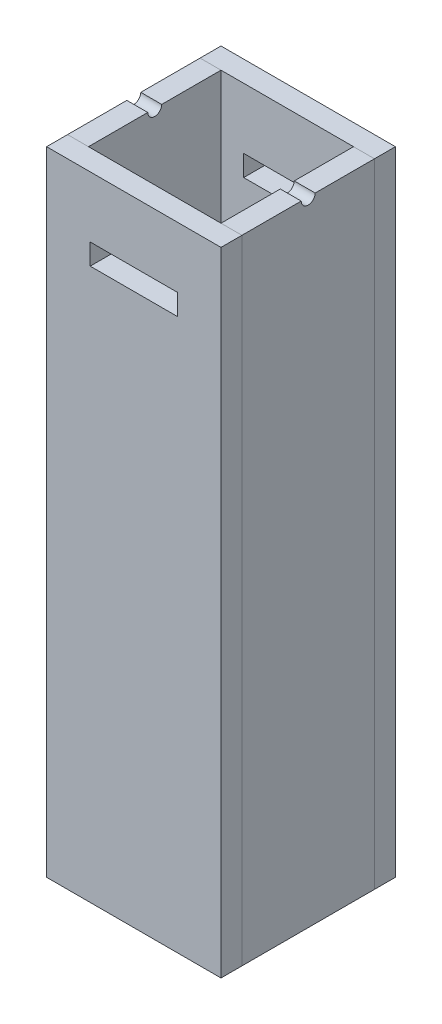
ISO-10303-21;
HEADER;
FILE_DESCRIPTION(('STEP AP214'),'2;1');
FILE_NAME('part.step','',(''),(''),'','','');
FILE_SCHEMA(('AUTOMOTIVE_DESIGN { 1 0 10303 214 1 1 1 1 }'));
ENDSEC;
DATA;
#1=APPLICATION_CONTEXT('core data for automotive mechanical design processes');
#2=APPLICATION_PROTOCOL_DEFINITION('international standard','automotive_design',2000,#1);
#3=PRODUCT_CONTEXT('',#1,'mechanical');
#4=PRODUCT('Part','Part','',(#3));
#5=PRODUCT_RELATED_PRODUCT_CATEGORY('part','',(#4));
#6=PRODUCT_DEFINITION_FORMATION('','',#4);
#7=PRODUCT_DEFINITION_CONTEXT('part definition',#1,'design');
#8=PRODUCT_DEFINITION('design','',#6,#7);
#9=PRODUCT_DEFINITION_SHAPE('','',#8);
#10=(LENGTH_UNIT() NAMED_UNIT(*) SI_UNIT(.MILLI.,.METRE.));
#11=(NAMED_UNIT(*) PLANE_ANGLE_UNIT() SI_UNIT($,.RADIAN.));
#12=(NAMED_UNIT(*) SI_UNIT($,.STERADIAN.) SOLID_ANGLE_UNIT());
#13=UNCERTAINTY_MEASURE_WITH_UNIT(LENGTH_MEASURE(1.E-05),#10,'distance_accuracy_value','');
#14=(GEOMETRIC_REPRESENTATION_CONTEXT(3) GLOBAL_UNCERTAINTY_ASSIGNED_CONTEXT((#13)) GLOBAL_UNIT_ASSIGNED_CONTEXT((#10,
#11,#12)) REPRESENTATION_CONTEXT('',''));
#15=CARTESIAN_POINT('',(0.,0.,0.));
#16=DIRECTION('',(0.,0.,1.));
#17=DIRECTION('',(1.,0.,0.));
#18=AXIS2_PLACEMENT_3D('',#15,#16,#17);
#19=CARTESIAN_POINT('',(-27.4556983702636,181.4148,200.513993011668));
#20=DIRECTION('',(0.,-1.,0.));
#21=DIRECTION('',(0.,0.,-1.));
#22=AXIS2_PLACEMENT_3D('',#19,#20,#21);
#23=PLANE('',#22);
#24=DIRECTION('',(0.,0.,-1.));
#25=VECTOR('',#24,1.);
#26=CARTESIAN_POINT('',(-27.4556983702636,181.4148,200.513993011668));
#27=LINE('',#26,#25);
#28=CARTESIAN_POINT('',(-27.4556983702636,181.4148,-2.));
#29=VERTEX_POINT('',#28);
#30=CARTESIAN_POINT('',(-27.4556983702636,181.4148,-19.));
#31=VERTEX_POINT('',#30);
#32=EDGE_CURVE('E107',#29,#31,#27,.T.);
#33=ORIENTED_EDGE('',*,*,#32,.F.);
#34=DIRECTION('',(1.,0.,0.));
#35=VECTOR('',#34,1.);
#36=CARTESIAN_POINT('',(-33.112552619756,181.4148,-2.));
#37=LINE('',#36,#35);
#38=CARTESIAN_POINT('',(-21.4556983702636,181.4148,-2.));
#39=VERTEX_POINT('',#38);
#40=EDGE_CURVE('E12',#29,#39,#37,.T.);
#41=ORIENTED_EDGE('',*,*,#40,.T.);
#42=DIRECTION('',(0.,0.,-1.));
#43=VECTOR('',#42,1.);
#44=CARTESIAN_POINT('',(-21.4556983702636,181.4148,200.513993011668));
#45=LINE('',#44,#43);
#46=CARTESIAN_POINT('',(-21.4556983702636,181.4148,-19.));
#47=VERTEX_POINT('',#46);
#48=EDGE_CURVE('E144',#39,#47,#45,.T.);
#49=ORIENTED_EDGE('',*,*,#48,.T.);
#50=DIRECTION('',(-1.,0.,0.));
#51=VECTOR('',#50,1.);
#52=CARTESIAN_POINT('',(-27.4556983702636,181.4148,-19.));
#53=LINE('',#52,#51);
#54=EDGE_CURVE('E111',#47,#31,#53,.T.);
#55=ORIENTED_EDGE('',*,*,#54,.T.);
#56=EDGE_LOOP('',(#33,#41,#49,#55));
#57=FACE_BOUND('',#56,.T.);
#58=ADVANCED_FACE('F47',(#57),#23,.F.);
#59=CARTESIAN_POINT('',(-27.4556983702636,0.,200.513993011668));
#60=DIRECTION('',(1.,0.,0.));
#61=DIRECTION('',(0.,0.,-1.));
#62=AXIS2_PLACEMENT_3D('',#59,#60,#61);
#63=PLANE('',#62);
#64=CARTESIAN_POINT('',(-27.4556983702636,181.4148,19.));
#65=VERTEX_POINT('',#64);
#66=CARTESIAN_POINT('',(-27.4556983702636,181.4148,2.));
#67=VERTEX_POINT('',#66);
#68=EDGE_CURVE('E69',#65,#67,#27,.T.);
#69=ORIENTED_EDGE('',*,*,#68,.T.);
#70=CARTESIAN_POINT('',(-27.4556983702636,181.4148,0.));
#71=DIRECTION('',(1.,0.,0.));
#72=DIRECTION('',(0.,0.,-1.));
#73=AXIS2_PLACEMENT_3D('',#70,#71,#72);
#74=CIRCLE('',#73,2.);
#75=EDGE_CURVE('E62',#29,#67,#74,.F.);
#76=ORIENTED_EDGE('',*,*,#75,.F.);
#77=ORIENTED_EDGE('',*,*,#32,.T.);
#78=DIRECTION('',(0.,-1.,0.));
#79=VECTOR('',#78,1.);
#80=CARTESIAN_POINT('',(-27.4556983702636,0.,-19.));
#81=LINE('',#80,#79);
#82=CARTESIAN_POINT('',(-27.4556983702636,0.,-19.));
#83=VERTEX_POINT('',#82);
#84=EDGE_CURVE('E114',#31,#83,#81,.T.);
#85=ORIENTED_EDGE('',*,*,#84,.T.);
#86=DIRECTION('',(0.,0.,-1.));
#87=VECTOR('',#86,1.);
#88=CARTESIAN_POINT('',(-27.4556983702636,0.,200.513993011668));
#89=LINE('',#88,#87);
#90=CARTESIAN_POINT('',(-27.4556983702636,0.,19.));
#91=VERTEX_POINT('',#90);
#92=EDGE_CURVE('E136',#91,#83,#89,.T.);
#93=ORIENTED_EDGE('',*,*,#92,.F.);
#94=DIRECTION('',(0.,-1.,0.));
#95=VECTOR('',#94,1.);
#96=CARTESIAN_POINT('',(-27.4556983702636,0.,19.));
#97=LINE('',#96,#95);
#98=EDGE_CURVE('E127',#65,#91,#97,.T.);
#99=ORIENTED_EDGE('',*,*,#98,.F.);
#100=EDGE_LOOP('',(#69,#76,#77,#85,#93,#99));
#101=FACE_BOUND('',#100,.T.);
#102=ADVANCED_FACE('F105',(#101),#63,.F.);
#103=CARTESIAN_POINT('',(-21.4556983702636,0.,200.513993011668));
#104=DIRECTION('',(0.,1.,0.));
#105=DIRECTION('',(0.,0.,1.));
#106=AXIS2_PLACEMENT_3D('',#103,#104,#105);
#107=PLANE('',#106);
#108=DIRECTION('',(1.,0.,0.));
#109=VECTOR('',#108,1.);
#110=CARTESIAN_POINT('',(-21.4556983702636,0.,19.));
#111=LINE('',#110,#109);
#112=CARTESIAN_POINT('',(-21.4556983702636,0.,19.));
#113=VERTEX_POINT('',#112);
#114=EDGE_CURVE('E122',#91,#113,#111,.T.);
#115=ORIENTED_EDGE('',*,*,#114,.F.);
#116=ORIENTED_EDGE('',*,*,#92,.T.);
#117=DIRECTION('',(1.,0.,0.));
#118=VECTOR('',#117,1.);
#119=CARTESIAN_POINT('',(-21.4556983702636,0.,-19.));
#120=LINE('',#119,#118);
#121=CARTESIAN_POINT('',(-21.4556983702636,0.,-19.));
#122=VERTEX_POINT('',#121);
#123=EDGE_CURVE('E137',#83,#122,#120,.T.);
#124=ORIENTED_EDGE('',*,*,#123,.T.);
#125=DIRECTION('',(0.,0.,-1.));
#126=VECTOR('',#125,1.);
#127=CARTESIAN_POINT('',(-21.4556983702636,0.,200.513993011668));
#128=LINE('',#127,#126);
#129=EDGE_CURVE('E138',#113,#122,#128,.T.);
#130=ORIENTED_EDGE('',*,*,#129,.F.);
#131=EDGE_LOOP('',(#115,#116,#124,#130));
#132=FACE_BOUND('',#131,.T.);
#133=ADVANCED_FACE('F162',(#132),#107,.F.);
#134=CARTESIAN_POINT('',(-21.4556983702636,181.4148,200.513993011668));
#135=DIRECTION('',(-1.,0.,0.));
#136=DIRECTION('',(0.,0.,1.));
#137=AXIS2_PLACEMENT_3D('',#134,#135,#136);
#138=PLANE('',#137);
#139=ORIENTED_EDGE('',*,*,#48,.F.);
#140=CARTESIAN_POINT('',(-21.4556983702636,181.4148,0.));
#141=DIRECTION('',(-1.,0.,0.));
#142=DIRECTION('',(0.,0.,1.));
#143=AXIS2_PLACEMENT_3D('',#140,#141,#142);
#144=CIRCLE('',#143,2.);
#145=CARTESIAN_POINT('',(-21.4556983702636,181.4148,2.));
#146=VERTEX_POINT('',#145);
#147=EDGE_CURVE('E100',#39,#146,#144,.T.);
#148=ORIENTED_EDGE('',*,*,#147,.T.);
#149=CARTESIAN_POINT('',(-21.4556983702636,181.4148,19.));
#150=VERTEX_POINT('',#149);
#151=EDGE_CURVE('E117',#150,#146,#45,.T.);
#152=ORIENTED_EDGE('',*,*,#151,.F.);
#153=DIRECTION('',(0.,1.,0.));
#154=VECTOR('',#153,1.);
#155=CARTESIAN_POINT('',(-21.4556983702636,181.4148,19.));
#156=LINE('',#155,#154);
#157=EDGE_CURVE('E119',#113,#150,#156,.T.);
#158=ORIENTED_EDGE('',*,*,#157,.F.);
#159=ORIENTED_EDGE('',*,*,#129,.T.);
#160=DIRECTION('',(0.,1.,0.));
#161=VECTOR('',#160,1.);
#162=CARTESIAN_POINT('',(-21.4556983702636,181.4148,-19.));
#163=LINE('',#162,#161);
#164=EDGE_CURVE('E139',#122,#47,#163,.T.);
#165=ORIENTED_EDGE('',*,*,#164,.T.);
#166=EDGE_LOOP('',(#139,#148,#152,#158,#159,#165));
#167=FACE_BOUND('',#166,.T.);
#168=ADVANCED_FACE('F150',(#167),#138,.F.);
#169=ORIENTED_EDGE('',*,*,#151,.T.);
#170=DIRECTION('',(1.,0.,0.));
#171=VECTOR('',#170,1.);
#172=CARTESIAN_POINT('',(-33.112552619756,181.4148,2.));
#173=LINE('',#172,#171);
#174=EDGE_CURVE('E55',#146,#67,#173,.F.);
#175=ORIENTED_EDGE('',*,*,#174,.T.);
#176=ORIENTED_EDGE('',*,*,#68,.F.);
#177=DIRECTION('',(-1.,0.,0.));
#178=VECTOR('',#177,1.);
#179=CARTESIAN_POINT('',(-27.4556983702636,181.4148,19.));
#180=LINE('',#179,#178);
#181=EDGE_CURVE('E134',#150,#65,#180,.T.);
#182=ORIENTED_EDGE('',*,*,#181,.F.);
#183=EDGE_LOOP('',(#169,#175,#176,#182));
#184=FACE_BOUND('',#183,.T.);
#185=ADVANCED_FACE('F154',(#184),#23,.F.);
#186=CARTESIAN_POINT('',(0.,0.,-19.));
#187=DIRECTION('',(0.,0.,-1.));
#188=DIRECTION('',(-1.,0.,0.));
#189=AXIS2_PLACEMENT_3D('',#186,#187,#188);
#190=PLANE('',#189);
#191=ORIENTED_EDGE('',*,*,#84,.F.);
#192=ORIENTED_EDGE('',*,*,#54,.F.);
#193=ORIENTED_EDGE('',*,*,#164,.F.);
#194=ORIENTED_EDGE('',*,*,#123,.F.);
#195=EDGE_LOOP('',(#191,#192,#193,#194));
#196=FACE_BOUND('',#195,.T.);
#197=ADVANCED_FACE('F152',(#196),#190,.T.);
#198=CARTESIAN_POINT('',(-27.4556983702636,181.4148,19.));
#199=DIRECTION('',(0.,0.,1.));
#200=DIRECTION('',(1.,0.,0.));
#201=AXIS2_PLACEMENT_3D('',#198,#199,#200);
#202=PLANE('',#201);
#203=ORIENTED_EDGE('',*,*,#181,.T.);
#204=ORIENTED_EDGE('',*,*,#98,.T.);
#205=ORIENTED_EDGE('',*,*,#114,.T.);
#206=ORIENTED_EDGE('',*,*,#157,.T.);
#207=EDGE_LOOP('',(#203,#204,#205,#206));
#208=FACE_BOUND('',#207,.T.);
#209=ADVANCED_FACE('F49',(#208),#202,.T.);
#210=CARTESIAN_POINT('',(-33.112552619756,181.4148,0.));
#211=DIRECTION('',(1.,0.,0.));
#212=DIRECTION('',(0.,0.,-1.));
#213=AXIS2_PLACEMENT_3D('',#210,#211,#212);
#214=CYLINDRICAL_SURFACE('',#213,2.);
#215=ORIENTED_EDGE('',*,*,#75,.T.);
#216=ORIENTED_EDGE('',*,*,#174,.F.);
#217=ORIENTED_EDGE('',*,*,#147,.F.);
#218=ORIENTED_EDGE('',*,*,#40,.F.);
#219=EDGE_LOOP('',(#215,#216,#217,#218));
#220=FACE_BOUND('',#219,.T.);
#221=ADVANCED_FACE('F98',(#220),#214,.F.);
#222=CLOSED_SHELL('',(#58,#102,#133,#168,#185,#197,#209,#221));
#223=MANIFOLD_SOLID_BREP('B2',#222);
#224=CARTESIAN_POINT('',(22.5443016297364,181.4148,200.513993011668));
#225=DIRECTION('',(0.,-1.,0.));
#226=DIRECTION('',(0.,0.,-1.));
#227=AXIS2_PLACEMENT_3D('',#224,#225,#226);
#228=PLANE('',#227);
#229=DIRECTION('',(0.,0.,-1.));
#230=VECTOR('',#229,1.);
#231=CARTESIAN_POINT('',(16.5443016297364,181.4148,200.513993011668));
#232=LINE('',#231,#230);
#233=CARTESIAN_POINT('',(16.5443016297364,181.4148,-2.));
#234=VERTEX_POINT('',#233);
#235=CARTESIAN_POINT('',(16.5443016297364,181.4148,-19.));
#236=VERTEX_POINT('',#235);
#237=EDGE_CURVE('E294',#234,#236,#232,.T.);
#238=ORIENTED_EDGE('',*,*,#237,.F.);
#239=DIRECTION('',(1.,0.,0.));
#240=VECTOR('',#239,1.);
#241=CARTESIAN_POINT('',(-33.112552619756,181.4148,-2.));
#242=LINE('',#241,#240);
#243=CARTESIAN_POINT('',(22.5443016297364,181.4148,-2.));
#244=VERTEX_POINT('',#243);
#245=EDGE_CURVE('E244',#234,#244,#242,.T.);
#246=ORIENTED_EDGE('',*,*,#245,.T.);
#247=DIRECTION('',(0.,0.,-1.));
#248=VECTOR('',#247,1.);
#249=CARTESIAN_POINT('',(22.5443016297364,181.4148,200.513993011668));
#250=LINE('',#249,#248);
#251=CARTESIAN_POINT('',(22.5443016297364,181.4148,-19.));
#252=VERTEX_POINT('',#251);
#253=EDGE_CURVE('E292',#244,#252,#250,.T.);
#254=ORIENTED_EDGE('',*,*,#253,.T.);
#255=DIRECTION('',(-1.,0.,0.));
#256=VECTOR('',#255,1.);
#257=CARTESIAN_POINT('',(22.5443016297364,181.4148,-19.));
#258=LINE('',#257,#256);
#259=EDGE_CURVE('E302',#252,#236,#258,.T.);
#260=ORIENTED_EDGE('',*,*,#259,.T.);
#261=EDGE_LOOP('',(#238,#246,#254,#260));
#262=FACE_BOUND('',#261,.T.);
#263=ADVANCED_FACE('F229',(#262),#228,.F.);
#264=CARTESIAN_POINT('',(22.5443016297364,181.4148,200.513993011668));
#265=DIRECTION('',(-1.,0.,0.));
#266=DIRECTION('',(0.,0.,1.));
#267=AXIS2_PLACEMENT_3D('',#264,#265,#266);
#268=PLANE('',#267);
#269=ORIENTED_EDGE('',*,*,#253,.F.);
#270=CARTESIAN_POINT('',(22.5443016297364,181.4148,0.));
#271=DIRECTION('',(1.,0.,0.));
#272=DIRECTION('',(0.,0.,-1.));
#273=AXIS2_PLACEMENT_3D('',#270,#271,#272);
#274=CIRCLE('',#273,2.);
#275=CARTESIAN_POINT('',(22.5443016297364,181.4148,2.));
#276=VERTEX_POINT('',#275);
#277=EDGE_CURVE('E280',#276,#244,#274,.T.);
#278=ORIENTED_EDGE('',*,*,#277,.F.);
#279=CARTESIAN_POINT('',(22.5443016297364,181.4148,19.));
#280=VERTEX_POINT('',#279);
#281=EDGE_CURVE('E300',#280,#276,#250,.T.);
#282=ORIENTED_EDGE('',*,*,#281,.F.);
#283=DIRECTION('',(0.,1.,0.));
#284=VECTOR('',#283,1.);
#285=CARTESIAN_POINT('',(22.5443016297364,181.4148,19.));
#286=LINE('',#285,#284);
#287=CARTESIAN_POINT('',(22.5443016297364,0.,19.));
#288=VERTEX_POINT('',#287);
#289=EDGE_CURVE('E315',#288,#280,#286,.T.);
#290=ORIENTED_EDGE('',*,*,#289,.F.);
#291=DIRECTION('',(0.,0.,-1.));
#292=VECTOR('',#291,1.);
#293=CARTESIAN_POINT('',(22.5443016297364,0.,200.513993011668));
#294=LINE('',#293,#292);
#295=CARTESIAN_POINT('',(22.5443016297364,0.,-19.));
#296=VERTEX_POINT('',#295);
#297=EDGE_CURVE('E251',#288,#296,#294,.T.);
#298=ORIENTED_EDGE('',*,*,#297,.T.);
#299=DIRECTION('',(0.,1.,0.));
#300=VECTOR('',#299,1.);
#301=CARTESIAN_POINT('',(22.5443016297364,181.4148,-19.));
#302=LINE('',#301,#300);
#303=EDGE_CURVE('E299',#296,#252,#302,.T.);
#304=ORIENTED_EDGE('',*,*,#303,.T.);
#305=EDGE_LOOP('',(#269,#278,#282,#290,#298,#304));
#306=FACE_BOUND('',#305,.T.);
#307=ADVANCED_FACE('F297',(#306),#268,.F.);
#308=ORIENTED_EDGE('',*,*,#281,.T.);
#309=DIRECTION('',(1.,0.,0.));
#310=VECTOR('',#309,1.);
#311=CARTESIAN_POINT('',(-33.112552619756,181.4148,2.));
#312=LINE('',#311,#310);
#313=CARTESIAN_POINT('',(16.5443016297364,181.4148,2.));
#314=VERTEX_POINT('',#313);
#315=EDGE_CURVE('E283',#276,#314,#312,.F.);
#316=ORIENTED_EDGE('',*,*,#315,.T.);
#317=CARTESIAN_POINT('',(16.5443016297364,181.4148,19.));
#318=VERTEX_POINT('',#317);
#319=EDGE_CURVE('E308',#318,#314,#232,.T.);
#320=ORIENTED_EDGE('',*,*,#319,.F.);
#321=DIRECTION('',(-1.,0.,0.));
#322=VECTOR('',#321,1.);
#323=CARTESIAN_POINT('',(22.5443016297364,181.4148,19.));
#324=LINE('',#323,#322);
#325=EDGE_CURVE('E329',#280,#318,#324,.T.);
#326=ORIENTED_EDGE('',*,*,#325,.F.);
#327=EDGE_LOOP('',(#308,#316,#320,#326));
#328=FACE_BOUND('',#327,.T.);
#329=ADVANCED_FACE('F336',(#328),#228,.F.);
#330=CARTESIAN_POINT('',(16.5443016297364,181.4148,200.513993011668));
#331=DIRECTION('',(1.,0.,0.));
#332=DIRECTION('',(0.,1.,0.));
#333=AXIS2_PLACEMENT_3D('',#330,#331,#332);
#334=PLANE('',#333);
#335=ORIENTED_EDGE('',*,*,#319,.T.);
#336=CARTESIAN_POINT('',(16.5443016297364,181.4148,0.));
#337=DIRECTION('',(1.,0.,0.));
#338=DIRECTION('',(0.,1.,0.));
#339=AXIS2_PLACEMENT_3D('',#336,#337,#338);
#340=CIRCLE('',#339,2.);
#341=EDGE_CURVE('E45',#314,#234,#340,.T.);
#342=ORIENTED_EDGE('',*,*,#341,.T.);
#343=ORIENTED_EDGE('',*,*,#237,.T.);
#344=DIRECTION('',(0.,-1.,0.));
#345=VECTOR('',#344,1.);
#346=CARTESIAN_POINT('',(16.5443016297364,181.4148,-19.));
#347=LINE('',#346,#345);
#348=CARTESIAN_POINT('',(16.5443016297364,0.,-19.));
#349=VERTEX_POINT('',#348);
#350=EDGE_CURVE('E311',#236,#349,#347,.T.);
#351=ORIENTED_EDGE('',*,*,#350,.T.);
#352=DIRECTION('',(0.,0.,-1.));
#353=VECTOR('',#352,1.);
#354=CARTESIAN_POINT('',(16.5443016297364,0.,200.513993011668));
#355=LINE('',#354,#353);
#356=CARTESIAN_POINT('',(16.5443016297364,0.,19.));
#357=VERTEX_POINT('',#356);
#358=EDGE_CURVE('E312',#357,#349,#355,.T.);
#359=ORIENTED_EDGE('',*,*,#358,.F.);
#360=DIRECTION('',(0.,-1.,0.));
#361=VECTOR('',#360,1.);
#362=CARTESIAN_POINT('',(16.5443016297364,181.4148,19.));
#363=LINE('',#362,#361);
#364=EDGE_CURVE('E237',#318,#357,#363,.T.);
#365=ORIENTED_EDGE('',*,*,#364,.F.);
#366=EDGE_LOOP('',(#335,#342,#343,#351,#359,#365));
#367=FACE_BOUND('',#366,.T.);
#368=ADVANCED_FACE('F334',(#367),#334,.F.);
#369=CARTESIAN_POINT('',(16.5443016297364,0.,200.513993011668));
#370=DIRECTION('',(0.,1.,0.));
#371=DIRECTION('',(0.,0.,1.));
#372=AXIS2_PLACEMENT_3D('',#369,#370,#371);
#373=PLANE('',#372);
#374=DIRECTION('',(1.,0.,0.));
#375=VECTOR('',#374,1.);
#376=CARTESIAN_POINT('',(16.5443016297364,0.,19.));
#377=LINE('',#376,#375);
#378=EDGE_CURVE('E306',#357,#288,#377,.T.);
#379=ORIENTED_EDGE('',*,*,#378,.F.);
#380=ORIENTED_EDGE('',*,*,#358,.T.);
#381=DIRECTION('',(1.,0.,0.));
#382=VECTOR('',#381,1.);
#383=CARTESIAN_POINT('',(16.5443016297364,0.,-19.));
#384=LINE('',#383,#382);
#385=EDGE_CURVE('E313',#349,#296,#384,.T.);
#386=ORIENTED_EDGE('',*,*,#385,.T.);
#387=ORIENTED_EDGE('',*,*,#297,.F.);
#388=EDGE_LOOP('',(#379,#380,#386,#387));
#389=FACE_BOUND('',#388,.T.);
#390=ADVANCED_FACE('F318',(#389),#373,.F.);
#391=CARTESIAN_POINT('',(0.,0.,-19.));
#392=DIRECTION('',(0.,0.,1.));
#393=DIRECTION('',(1.,0.,0.));
#394=AXIS2_PLACEMENT_3D('',#391,#392,#393);
#395=PLANE('',#394);
#396=ORIENTED_EDGE('',*,*,#303,.F.);
#397=ORIENTED_EDGE('',*,*,#385,.F.);
#398=ORIENTED_EDGE('',*,*,#350,.F.);
#399=ORIENTED_EDGE('',*,*,#259,.F.);
#400=EDGE_LOOP('',(#396,#397,#398,#399));
#401=FACE_BOUND('',#400,.T.);
#402=ADVANCED_FACE('F323',(#401),#395,.F.);
#403=CARTESIAN_POINT('',(-27.4556983702636,181.4148,19.));
#404=DIRECTION('',(0.,0.,1.));
#405=DIRECTION('',(1.,0.,0.));
#406=AXIS2_PLACEMENT_3D('',#403,#404,#405);
#407=PLANE('',#406);
#408=ORIENTED_EDGE('',*,*,#378,.T.);
#409=ORIENTED_EDGE('',*,*,#289,.T.);
#410=ORIENTED_EDGE('',*,*,#325,.T.);
#411=ORIENTED_EDGE('',*,*,#364,.T.);
#412=EDGE_LOOP('',(#408,#409,#410,#411));
#413=FACE_BOUND('',#412,.T.);
#414=ADVANCED_FACE('F231',(#413),#407,.T.);
#415=CARTESIAN_POINT('',(-33.112552619756,181.4148,0.));
#416=DIRECTION('',(1.,0.,0.));
#417=DIRECTION('',(0.,0.,-1.));
#418=AXIS2_PLACEMENT_3D('',#415,#416,#417);
#419=CYLINDRICAL_SURFACE('',#418,2.);
#420=ORIENTED_EDGE('',*,*,#341,.F.);
#421=ORIENTED_EDGE('',*,*,#315,.F.);
#422=ORIENTED_EDGE('',*,*,#277,.T.);
#423=ORIENTED_EDGE('',*,*,#245,.F.);
#424=EDGE_LOOP('',(#420,#421,#422,#423));
#425=FACE_BOUND('',#424,.T.);
#426=ADVANCED_FACE('F281',(#425),#419,.F.);
#427=CLOSED_SHELL('',(#263,#307,#329,#368,#390,#402,#414,#426));
#428=MANIFOLD_SOLID_BREP('B6',#427);
#429=CARTESIAN_POINT('',(22.5443016297364,181.4148,-19.));
#430=DIRECTION('',(0.,0.,-1.));
#431=DIRECTION('',(-1.,0.,0.));
#432=AXIS2_PLACEMENT_3D('',#429,#430,#431);
#433=PLANE('',#432);
#434=DIRECTION('',(0.,-1.,0.));
#435=VECTOR('',#434,1.);
#436=CARTESIAN_POINT('',(10.0443016297364,181.4148,-19.));
#437=LINE('',#436,#435);
#438=CARTESIAN_POINT('',(10.0443016297364,164.,-19.));
#439=VERTEX_POINT('',#438);
#440=CARTESIAN_POINT('',(10.0443016297364,158.,-19.));
#441=VERTEX_POINT('',#440);
#442=EDGE_CURVE('E476',#439,#441,#437,.T.);
#443=ORIENTED_EDGE('',*,*,#442,.T.);
#444=DIRECTION('',(-1.,0.,0.));
#445=VECTOR('',#444,1.);
#446=CARTESIAN_POINT('',(22.5443016297364,158.,-19.));
#447=LINE('',#446,#445);
#448=CARTESIAN_POINT('',(-14.9556983702636,158.,-19.));
#449=VERTEX_POINT('',#448);
#450=EDGE_CURVE('E484',#441,#449,#447,.T.);
#451=ORIENTED_EDGE('',*,*,#450,.T.);
#452=DIRECTION('',(0.,1.,0.));
#453=VECTOR('',#452,1.);
#454=CARTESIAN_POINT('',(-14.9556983702636,181.4148,-19.));
#455=LINE('',#454,#453);
#456=CARTESIAN_POINT('',(-14.9556983702636,164.,-19.));
#457=VERTEX_POINT('',#456);
#458=EDGE_CURVE('E506',#449,#457,#455,.T.);
#459=ORIENTED_EDGE('',*,*,#458,.T.);
#460=DIRECTION('',(1.,0.,0.));
#461=VECTOR('',#460,1.);
#462=CARTESIAN_POINT('',(22.5443016297364,164.,-19.));
#463=LINE('',#462,#461);
#464=EDGE_CURVE('E503',#457,#439,#463,.T.);
#465=ORIENTED_EDGE('',*,*,#464,.T.);
#466=EDGE_LOOP('',(#443,#451,#459,#465));
#467=FACE_BOUND('',#466,.T.);
#468=DIRECTION('',(1.,0.,0.));
#469=VECTOR('',#468,1.);
#470=CARTESIAN_POINT('',(22.5443016297364,0.,-19.));
#471=LINE('',#470,#469);
#472=CARTESIAN_POINT('',(-27.4556983702636,0.,-19.));
#473=VERTEX_POINT('',#472);
#474=CARTESIAN_POINT('',(22.5443016297364,0.,-19.));
#475=VERTEX_POINT('',#474);
#476=EDGE_CURVE('E510',#473,#475,#471,.T.);
#477=ORIENTED_EDGE('',*,*,#476,.T.);
#478=DIRECTION('',(0.,-1.,0.));
#479=VECTOR('',#478,1.);
#480=CARTESIAN_POINT('',(22.5443016297364,181.4148,-19.));
#481=LINE('',#480,#479);
#482=CARTESIAN_POINT('',(22.5443016297364,181.4148,-19.));
#483=VERTEX_POINT('',#482);
#484=EDGE_CURVE('E227',#483,#475,#481,.T.);
#485=ORIENTED_EDGE('',*,*,#484,.F.);
#486=DIRECTION('',(1.,0.,0.));
#487=VECTOR('',#486,1.);
#488=CARTESIAN_POINT('',(22.5443016297364,181.4148,-19.));
#489=LINE('',#488,#487);
#490=CARTESIAN_POINT('',(-27.4556983702636,181.4148,-19.));
#491=VERTEX_POINT('',#490);
#492=EDGE_CURVE('E511',#491,#483,#489,.T.);
#493=ORIENTED_EDGE('',*,*,#492,.F.);
#494=DIRECTION('',(0.,-1.,0.));
#495=VECTOR('',#494,1.);
#496=CARTESIAN_POINT('',(-27.4556983702636,181.4148,-19.));
#497=LINE('',#496,#495);
#498=EDGE_CURVE('E521',#491,#473,#497,.T.);
#499=ORIENTED_EDGE('',*,*,#498,.T.);
#500=EDGE_LOOP('',(#477,#485,#493,#499));
#501=FACE_BOUND('',#500,.T.);
#502=ADVANCED_FACE('F410',(#467,#501),#433,.F.);
#503=CARTESIAN_POINT('',(22.5443016297364,181.4148,-25.));
#504=DIRECTION('',(-1.,0.,0.));
#505=DIRECTION('',(0.,0.,1.));
#506=AXIS2_PLACEMENT_3D('',#503,#504,#505);
#507=PLANE('',#506);
#508=DIRECTION('',(0.,0.,-1.));
#509=VECTOR('',#508,1.);
#510=CARTESIAN_POINT('',(22.5443016297364,0.,-25.));
#511=LINE('',#510,#509);
#512=CARTESIAN_POINT('',(22.5443016297364,0.,-25.));
#513=VERTEX_POINT('',#512);
#514=EDGE_CURVE('E524',#475,#513,#511,.T.);
#515=ORIENTED_EDGE('',*,*,#514,.T.);
#516=DIRECTION('',(0.,-1.,0.));
#517=VECTOR('',#516,1.);
#518=CARTESIAN_POINT('',(22.5443016297364,181.4148,-25.));
#519=LINE('',#518,#517);
#520=CARTESIAN_POINT('',(22.5443016297364,181.4148,-25.));
#521=VERTEX_POINT('',#520);
#522=EDGE_CURVE('E417',#521,#513,#519,.T.);
#523=ORIENTED_EDGE('',*,*,#522,.F.);
#524=DIRECTION('',(0.,0.,-1.));
#525=VECTOR('',#524,1.);
#526=CARTESIAN_POINT('',(22.5443016297364,181.4148,-25.));
#527=LINE('',#526,#525);
#528=EDGE_CURVE('E514',#483,#521,#527,.T.);
#529=ORIENTED_EDGE('',*,*,#528,.F.);
#530=ORIENTED_EDGE('',*,*,#484,.T.);
#531=EDGE_LOOP('',(#515,#523,#529,#530));
#532=FACE_BOUND('',#531,.T.);
#533=ADVANCED_FACE('F552',(#532),#507,.F.);
#534=CARTESIAN_POINT('',(-27.4556983702636,181.4148,-25.));
#535=DIRECTION('',(0.,0.,1.));
#536=DIRECTION('',(1.,0.,0.));
#537=AXIS2_PLACEMENT_3D('',#534,#535,#536);
#538=PLANE('',#537);
#539=DIRECTION('',(0.,1.,0.));
#540=VECTOR('',#539,1.);
#541=CARTESIAN_POINT('',(-14.9556983702636,158.,-25.));
#542=LINE('',#541,#540);
#543=CARTESIAN_POINT('',(-14.9556983702636,158.,-25.));
#544=VERTEX_POINT('',#543);
#545=CARTESIAN_POINT('',(-14.9556983702636,164.,-25.));
#546=VERTEX_POINT('',#545);
#547=EDGE_CURVE('E490',#544,#546,#542,.T.);
#548=ORIENTED_EDGE('',*,*,#547,.F.);
#549=DIRECTION('',(-1.,0.,0.));
#550=VECTOR('',#549,1.);
#551=CARTESIAN_POINT('',(10.0443016297364,158.,-25.));
#552=LINE('',#551,#550);
#553=CARTESIAN_POINT('',(10.0443016297364,158.,-25.));
#554=VERTEX_POINT('',#553);
#555=EDGE_CURVE('E477',#554,#544,#552,.T.);
#556=ORIENTED_EDGE('',*,*,#555,.F.);
#557=DIRECTION('',(0.,-1.,0.));
#558=VECTOR('',#557,1.);
#559=CARTESIAN_POINT('',(10.0443016297364,164.,-25.));
#560=LINE('',#559,#558);
#561=CARTESIAN_POINT('',(10.0443016297364,164.,-25.));
#562=VERTEX_POINT('',#561);
#563=EDGE_CURVE('E471',#562,#554,#560,.T.);
#564=ORIENTED_EDGE('',*,*,#563,.F.);
#565=DIRECTION('',(1.,0.,0.));
#566=VECTOR('',#565,1.);
#567=CARTESIAN_POINT('',(-14.9556983702636,164.,-25.));
#568=LINE('',#567,#566);
#569=EDGE_CURVE('E492',#546,#562,#568,.T.);
#570=ORIENTED_EDGE('',*,*,#569,.F.);
#571=EDGE_LOOP('',(#548,#556,#564,#570));
#572=FACE_BOUND('',#571,.T.);
#573=DIRECTION('',(-1.,0.,0.));
#574=VECTOR('',#573,1.);
#575=CARTESIAN_POINT('',(-27.4556983702636,0.,-25.));
#576=LINE('',#575,#574);
#577=CARTESIAN_POINT('',(-27.4556983702636,0.,-25.));
#578=VERTEX_POINT('',#577);
#579=EDGE_CURVE('E526',#513,#578,#576,.T.);
#580=ORIENTED_EDGE('',*,*,#579,.T.);
#581=DIRECTION('',(0.,-1.,0.));
#582=VECTOR('',#581,1.);
#583=CARTESIAN_POINT('',(-27.4556983702636,181.4148,-25.));
#584=LINE('',#583,#582);
#585=CARTESIAN_POINT('',(-27.4556983702636,181.4148,-25.));
#586=VERTEX_POINT('',#585);
#587=EDGE_CURVE('E531',#586,#578,#584,.T.);
#588=ORIENTED_EDGE('',*,*,#587,.F.);
#589=DIRECTION('',(-1.,0.,0.));
#590=VECTOR('',#589,1.);
#591=CARTESIAN_POINT('',(-27.4556983702636,181.4148,-25.));
#592=LINE('',#591,#590);
#593=EDGE_CURVE('E517',#521,#586,#592,.T.);
#594=ORIENTED_EDGE('',*,*,#593,.F.);
#595=ORIENTED_EDGE('',*,*,#522,.T.);
#596=EDGE_LOOP('',(#580,#588,#594,#595));
#597=FACE_BOUND('',#596,.T.);
#598=ADVANCED_FACE('F488',(#572,#597),#538,.F.);
#599=CARTESIAN_POINT('',(-27.4556983702636,181.4148,-25.));
#600=DIRECTION('',(1.,0.,0.));
#601=DIRECTION('',(0.,0.,-1.));
#602=AXIS2_PLACEMENT_3D('',#599,#600,#601);
#603=PLANE('',#602);
#604=DIRECTION('',(0.,0.,1.));
#605=VECTOR('',#604,1.);
#606=CARTESIAN_POINT('',(-27.4556983702636,0.,-25.));
#607=LINE('',#606,#605);
#608=EDGE_CURVE('E515',#578,#473,#607,.T.);
#609=ORIENTED_EDGE('',*,*,#608,.T.);
#610=ORIENTED_EDGE('',*,*,#498,.F.);
#611=DIRECTION('',(0.,0.,1.));
#612=VECTOR('',#611,1.);
#613=CARTESIAN_POINT('',(-27.4556983702636,181.4148,-25.));
#614=LINE('',#613,#612);
#615=EDGE_CURVE('E519',#586,#491,#614,.T.);
#616=ORIENTED_EDGE('',*,*,#615,.F.);
#617=ORIENTED_EDGE('',*,*,#587,.T.);
#618=EDGE_LOOP('',(#609,#610,#616,#617));
#619=FACE_BOUND('',#618,.T.);
#620=ADVANCED_FACE('F545',(#619),#603,.F.);
#621=CARTESIAN_POINT('',(0.,181.4148,0.));
#622=DIRECTION('',(0.,1.,0.));
#623=DIRECTION('',(0.,0.,1.));
#624=AXIS2_PLACEMENT_3D('',#621,#622,#623);
#625=PLANE('',#624);
#626=ORIENTED_EDGE('',*,*,#492,.T.);
#627=ORIENTED_EDGE('',*,*,#528,.T.);
#628=ORIENTED_EDGE('',*,*,#593,.T.);
#629=ORIENTED_EDGE('',*,*,#615,.T.);
#630=EDGE_LOOP('',(#626,#627,#628,#629));
#631=FACE_BOUND('',#630,.T.);
#632=ADVANCED_FACE('F551',(#631),#625,.T.);
#633=CARTESIAN_POINT('',(0.,0.,0.));
#634=DIRECTION('',(0.,1.,0.));
#635=DIRECTION('',(0.,0.,1.));
#636=AXIS2_PLACEMENT_3D('',#633,#634,#635);
#637=PLANE('',#636);
#638=ORIENTED_EDGE('',*,*,#476,.F.);
#639=ORIENTED_EDGE('',*,*,#608,.F.);
#640=ORIENTED_EDGE('',*,*,#579,.F.);
#641=ORIENTED_EDGE('',*,*,#514,.F.);
#642=EDGE_LOOP('',(#638,#639,#640,#641));
#643=FACE_BOUND('',#642,.T.);
#644=ADVANCED_FACE('F542',(#643),#637,.F.);
#645=CARTESIAN_POINT('',(10.0443016297364,158.,-50.7099202643649));
#646=DIRECTION('',(0.,-1.,0.));
#647=DIRECTION('',(0.,0.,-1.));
#648=AXIS2_PLACEMENT_3D('',#645,#646,#647);
#649=PLANE('',#648);
#650=DIRECTION('',(0.,0.,1.));
#651=VECTOR('',#650,1.);
#652=CARTESIAN_POINT('',(10.0443016297364,158.,-50.7099202643649));
#653=LINE('',#652,#651);
#654=EDGE_CURVE('E424',#554,#441,#653,.T.);
#655=ORIENTED_EDGE('',*,*,#654,.F.);
#656=ORIENTED_EDGE('',*,*,#555,.T.);
#657=DIRECTION('',(0.,0.,1.));
#658=VECTOR('',#657,1.);
#659=CARTESIAN_POINT('',(-14.9556983702636,158.,-50.7099202643649));
#660=LINE('',#659,#658);
#661=EDGE_CURVE('E496',#544,#449,#660,.T.);
#662=ORIENTED_EDGE('',*,*,#661,.T.);
#663=ORIENTED_EDGE('',*,*,#450,.F.);
#664=EDGE_LOOP('',(#655,#656,#662,#663));
#665=FACE_BOUND('',#664,.T.);
#666=ADVANCED_FACE('F480',(#665),#649,.F.);
#667=CARTESIAN_POINT('',(-14.9556983702636,158.,-50.7099202643649));
#668=DIRECTION('',(-1.,0.,0.));
#669=DIRECTION('',(0.,0.,1.));
#670=AXIS2_PLACEMENT_3D('',#667,#668,#669);
#671=PLANE('',#670);
#672=ORIENTED_EDGE('',*,*,#661,.F.);
#673=ORIENTED_EDGE('',*,*,#547,.T.);
#674=DIRECTION('',(0.,0.,1.));
#675=VECTOR('',#674,1.);
#676=CARTESIAN_POINT('',(-14.9556983702636,164.,-50.7099202643649));
#677=LINE('',#676,#675);
#678=EDGE_CURVE('E498',#546,#457,#677,.T.);
#679=ORIENTED_EDGE('',*,*,#678,.T.);
#680=ORIENTED_EDGE('',*,*,#458,.F.);
#681=EDGE_LOOP('',(#672,#673,#679,#680));
#682=FACE_BOUND('',#681,.T.);
#683=ADVANCED_FACE('F569',(#682),#671,.F.);
#684=CARTESIAN_POINT('',(-14.9556983702636,164.,-50.7099202643649));
#685=DIRECTION('',(0.,1.,0.));
#686=DIRECTION('',(0.,0.,1.));
#687=AXIS2_PLACEMENT_3D('',#684,#685,#686);
#688=PLANE('',#687);
#689=ORIENTED_EDGE('',*,*,#678,.F.);
#690=ORIENTED_EDGE('',*,*,#569,.T.);
#691=DIRECTION('',(0.,0.,1.));
#692=VECTOR('',#691,1.);
#693=CARTESIAN_POINT('',(10.0443016297364,164.,-50.7099202643649));
#694=LINE('',#693,#692);
#695=EDGE_CURVE('E429',#562,#439,#694,.T.);
#696=ORIENTED_EDGE('',*,*,#695,.T.);
#697=ORIENTED_EDGE('',*,*,#464,.F.);
#698=EDGE_LOOP('',(#689,#690,#696,#697));
#699=FACE_BOUND('',#698,.T.);
#700=ADVANCED_FACE('F572',(#699),#688,.F.);
#701=CARTESIAN_POINT('',(10.0443016297364,164.,-50.7099202643649));
#702=DIRECTION('',(1.,0.,0.));
#703=DIRECTION('',(0.,0.,-1.));
#704=AXIS2_PLACEMENT_3D('',#701,#702,#703);
#705=PLANE('',#704);
#706=ORIENTED_EDGE('',*,*,#695,.F.);
#707=ORIENTED_EDGE('',*,*,#563,.T.);
#708=ORIENTED_EDGE('',*,*,#654,.T.);
#709=ORIENTED_EDGE('',*,*,#442,.F.);
#710=EDGE_LOOP('',(#706,#707,#708,#709));
#711=FACE_BOUND('',#710,.T.);
#712=ADVANCED_FACE('F472',(#711),#705,.F.);
#713=CLOSED_SHELL('',(#502,#533,#598,#620,#632,#644,#666,#683,#700,#712));
#714=MANIFOLD_SOLID_BREP('B39',#713);
#715=CARTESIAN_POINT('',(-27.4556983702636,181.4148,19.));
#716=DIRECTION('',(0.,0.,1.));
#717=DIRECTION('',(1.,0.,0.));
#718=AXIS2_PLACEMENT_3D('',#715,#716,#717);
#719=PLANE('',#718);
#720=DIRECTION('',(0.,-1.,0.));
#721=VECTOR('',#720,1.);
#722=CARTESIAN_POINT('',(-14.9556983702636,181.4148,19.));
#723=LINE('',#722,#721);
#724=CARTESIAN_POINT('',(-14.9556983702636,164.,19.));
#725=VERTEX_POINT('',#724);
#726=CARTESIAN_POINT('',(-14.9556983702636,158.,19.));
#727=VERTEX_POINT('',#726);
#728=EDGE_CURVE('E734',#725,#727,#723,.T.);
#729=ORIENTED_EDGE('',*,*,#728,.T.);
#730=DIRECTION('',(1.,0.,0.));
#731=VECTOR('',#730,1.);
#732=CARTESIAN_POINT('',(-27.4556983702636,158.,19.));
#733=LINE('',#732,#731);
#734=CARTESIAN_POINT('',(10.0443016297364,158.,19.));
#735=VERTEX_POINT('',#734);
#736=EDGE_CURVE('E737',#727,#735,#733,.T.);
#737=ORIENTED_EDGE('',*,*,#736,.T.);
#738=DIRECTION('',(0.,1.,0.));
#739=VECTOR('',#738,1.);
#740=CARTESIAN_POINT('',(10.0443016297364,181.4148,19.));
#741=LINE('',#740,#739);
#742=CARTESIAN_POINT('',(10.0443016297364,164.,19.));
#743=VERTEX_POINT('',#742);
#744=EDGE_CURVE('E729',#735,#743,#741,.T.);
#745=ORIENTED_EDGE('',*,*,#744,.T.);
#746=DIRECTION('',(-1.,0.,0.));
#747=VECTOR('',#746,1.);
#748=CARTESIAN_POINT('',(-27.4556983702636,164.,19.));
#749=LINE('',#748,#747);
#750=EDGE_CURVE('E709',#743,#725,#749,.T.);
#751=ORIENTED_EDGE('',*,*,#750,.T.);
#752=EDGE_LOOP('',(#729,#737,#745,#751));
#753=FACE_BOUND('',#752,.T.);
#754=DIRECTION('',(-1.,0.,0.));
#755=VECTOR('',#754,1.);
#756=CARTESIAN_POINT('',(-27.4556983702636,0.,19.));
#757=LINE('',#756,#755);
#758=CARTESIAN_POINT('',(22.5443016297364,0.,19.));
#759=VERTEX_POINT('',#758);
#760=CARTESIAN_POINT('',(-27.4556983702636,0.,19.));
#761=VERTEX_POINT('',#760);
#762=EDGE_CURVE('E740',#759,#761,#757,.T.);
#763=ORIENTED_EDGE('',*,*,#762,.T.);
#764=DIRECTION('',(0.,-1.,0.));
#765=VECTOR('',#764,1.);
#766=CARTESIAN_POINT('',(-27.4556983702636,181.4148,19.));
#767=LINE('',#766,#765);
#768=CARTESIAN_POINT('',(-27.4556983702636,181.4148,19.));
#769=VERTEX_POINT('',#768);
#770=EDGE_CURVE('E408',#769,#761,#767,.T.);
#771=ORIENTED_EDGE('',*,*,#770,.F.);
#772=DIRECTION('',(-1.,0.,0.));
#773=VECTOR('',#772,1.);
#774=CARTESIAN_POINT('',(-27.4556983702636,181.4148,19.));
#775=LINE('',#774,#773);
#776=CARTESIAN_POINT('',(22.5443016297364,181.4148,19.));
#777=VERTEX_POINT('',#776);
#778=EDGE_CURVE('E741',#777,#769,#775,.T.);
#779=ORIENTED_EDGE('',*,*,#778,.F.);
#780=DIRECTION('',(0.,-1.,0.));
#781=VECTOR('',#780,1.);
#782=CARTESIAN_POINT('',(22.5443016297364,181.4148,19.));
#783=LINE('',#782,#781);
#784=EDGE_CURVE('E751',#777,#759,#783,.T.);
#785=ORIENTED_EDGE('',*,*,#784,.T.);
#786=EDGE_LOOP('',(#763,#771,#779,#785));
#787=FACE_BOUND('',#786,.T.);
#788=ADVANCED_FACE('F639',(#753,#787),#719,.F.);
#789=CARTESIAN_POINT('',(-27.4556983702636,181.4148,19.));
#790=DIRECTION('',(1.,0.,0.));
#791=DIRECTION('',(0.,0.,-1.));
#792=AXIS2_PLACEMENT_3D('',#789,#790,#791);
#793=PLANE('',#792);
#794=DIRECTION('',(0.,0.,1.));
#795=VECTOR('',#794,1.);
#796=CARTESIAN_POINT('',(-27.4556983702636,0.,19.));
#797=LINE('',#796,#795);
#798=CARTESIAN_POINT('',(-27.4556983702636,0.,25.));
#799=VERTEX_POINT('',#798);
#800=EDGE_CURVE('E754',#761,#799,#797,.T.);
#801=ORIENTED_EDGE('',*,*,#800,.T.);
#802=DIRECTION('',(0.,-1.,0.));
#803=VECTOR('',#802,1.);
#804=CARTESIAN_POINT('',(-27.4556983702636,181.4148,25.));
#805=LINE('',#804,#803);
#806=CARTESIAN_POINT('',(-27.4556983702636,181.4148,25.));
#807=VERTEX_POINT('',#806);
#808=EDGE_CURVE('E646',#807,#799,#805,.T.);
#809=ORIENTED_EDGE('',*,*,#808,.F.);
#810=DIRECTION('',(0.,0.,1.));
#811=VECTOR('',#810,1.);
#812=CARTESIAN_POINT('',(-27.4556983702636,181.4148,19.));
#813=LINE('',#812,#811);
#814=EDGE_CURVE('E744',#769,#807,#813,.T.);
#815=ORIENTED_EDGE('',*,*,#814,.F.);
#816=ORIENTED_EDGE('',*,*,#770,.T.);
#817=EDGE_LOOP('',(#801,#809,#815,#816));
#818=FACE_BOUND('',#817,.T.);
#819=ADVANCED_FACE('F782',(#818),#793,.F.);
#820=CARTESIAN_POINT('',(22.5443016297364,181.4148,25.));
#821=DIRECTION('',(0.,0.,-1.));
#822=DIRECTION('',(-1.,0.,0.));
#823=AXIS2_PLACEMENT_3D('',#820,#821,#822);
#824=PLANE('',#823);
#825=DIRECTION('',(0.,1.,0.));
#826=VECTOR('',#825,1.);
#827=CARTESIAN_POINT('',(10.0443016297364,164.,25.));
#828=LINE('',#827,#826);
#829=CARTESIAN_POINT('',(10.0443016297364,158.,25.));
#830=VERTEX_POINT('',#829);
#831=CARTESIAN_POINT('',(10.0443016297364,164.,25.));
#832=VERTEX_POINT('',#831);
#833=EDGE_CURVE('E715',#830,#832,#828,.T.);
#834=ORIENTED_EDGE('',*,*,#833,.F.);
#835=DIRECTION('',(1.,0.,0.));
#836=VECTOR('',#835,1.);
#837=CARTESIAN_POINT('',(10.0443016297364,158.,25.));
#838=LINE('',#837,#836);
#839=CARTESIAN_POINT('',(-14.9556983702636,158.,25.));
#840=VERTEX_POINT('',#839);
#841=EDGE_CURVE('E661',#840,#830,#838,.T.);
#842=ORIENTED_EDGE('',*,*,#841,.F.);
#843=DIRECTION('',(0.,-1.,0.));
#844=VECTOR('',#843,1.);
#845=CARTESIAN_POINT('',(-14.9556983702636,158.,25.));
#846=LINE('',#845,#844);
#847=CARTESIAN_POINT('',(-14.9556983702636,164.,25.));
#848=VERTEX_POINT('',#847);
#849=EDGE_CURVE('E722',#848,#840,#846,.T.);
#850=ORIENTED_EDGE('',*,*,#849,.F.);
#851=DIRECTION('',(-1.,0.,0.));
#852=VECTOR('',#851,1.);
#853=CARTESIAN_POINT('',(-14.9556983702636,164.,25.));
#854=LINE('',#853,#852);
#855=EDGE_CURVE('E706',#832,#848,#854,.T.);
#856=ORIENTED_EDGE('',*,*,#855,.F.);
#857=EDGE_LOOP('',(#834,#842,#850,#856));
#858=FACE_BOUND('',#857,.T.);
#859=DIRECTION('',(1.,0.,0.));
#860=VECTOR('',#859,1.);
#861=CARTESIAN_POINT('',(22.5443016297364,0.,25.));
#862=LINE('',#861,#860);
#863=CARTESIAN_POINT('',(22.5443016297364,0.,25.));
#864=VERTEX_POINT('',#863);
#865=EDGE_CURVE('E756',#799,#864,#862,.T.);
#866=ORIENTED_EDGE('',*,*,#865,.T.);
#867=DIRECTION('',(0.,-1.,0.));
#868=VECTOR('',#867,1.);
#869=CARTESIAN_POINT('',(22.5443016297364,181.4148,25.));
#870=LINE('',#869,#868);
#871=CARTESIAN_POINT('',(22.5443016297364,181.4148,25.));
#872=VERTEX_POINT('',#871);
#873=EDGE_CURVE('E761',#872,#864,#870,.T.);
#874=ORIENTED_EDGE('',*,*,#873,.F.);
#875=DIRECTION('',(1.,0.,0.));
#876=VECTOR('',#875,1.);
#877=CARTESIAN_POINT('',(22.5443016297364,181.4148,25.));
#878=LINE('',#877,#876);
#879=EDGE_CURVE('E747',#807,#872,#878,.T.);
#880=ORIENTED_EDGE('',*,*,#879,.F.);
#881=ORIENTED_EDGE('',*,*,#808,.T.);
#882=EDGE_LOOP('',(#866,#874,#880,#881));
#883=FACE_BOUND('',#882,.T.);
#884=ADVANCED_FACE('F719',(#858,#883),#824,.F.);
#885=CARTESIAN_POINT('',(22.5443016297364,181.4148,19.));
#886=DIRECTION('',(-1.,0.,0.));
#887=DIRECTION('',(0.,0.,1.));
#888=AXIS2_PLACEMENT_3D('',#885,#886,#887);
#889=PLANE('',#888);
#890=DIRECTION('',(0.,0.,-1.));
#891=VECTOR('',#890,1.);
#892=CARTESIAN_POINT('',(22.5443016297364,0.,19.));
#893=LINE('',#892,#891);
#894=EDGE_CURVE('E745',#864,#759,#893,.T.);
#895=ORIENTED_EDGE('',*,*,#894,.T.);
#896=ORIENTED_EDGE('',*,*,#784,.F.);
#897=DIRECTION('',(0.,0.,-1.));
#898=VECTOR('',#897,1.);
#899=CARTESIAN_POINT('',(22.5443016297364,181.4148,19.));
#900=LINE('',#899,#898);
#901=EDGE_CURVE('E749',#872,#777,#900,.T.);
#902=ORIENTED_EDGE('',*,*,#901,.F.);
#903=ORIENTED_EDGE('',*,*,#873,.T.);
#904=EDGE_LOOP('',(#895,#896,#902,#903));
#905=FACE_BOUND('',#904,.T.);
#906=ADVANCED_FACE('F775',(#905),#889,.F.);
#907=CARTESIAN_POINT('',(0.,181.4148,0.));
#908=DIRECTION('',(0.,-1.,0.));
#909=DIRECTION('',(0.,0.,-1.));
#910=AXIS2_PLACEMENT_3D('',#907,#908,#909);
#911=PLANE('',#910);
#912=ORIENTED_EDGE('',*,*,#778,.T.);
#913=ORIENTED_EDGE('',*,*,#814,.T.);
#914=ORIENTED_EDGE('',*,*,#879,.T.);
#915=ORIENTED_EDGE('',*,*,#901,.T.);
#916=EDGE_LOOP('',(#912,#913,#914,#915));
#917=FACE_BOUND('',#916,.T.);
#918=ADVANCED_FACE('F781',(#917),#911,.F.);
#919=CARTESIAN_POINT('',(0.,0.,0.));
#920=DIRECTION('',(0.,-1.,0.));
#921=DIRECTION('',(0.,0.,-1.));
#922=AXIS2_PLACEMENT_3D('',#919,#920,#921);
#923=PLANE('',#922);
#924=ORIENTED_EDGE('',*,*,#762,.F.);
#925=ORIENTED_EDGE('',*,*,#894,.F.);
#926=ORIENTED_EDGE('',*,*,#865,.F.);
#927=ORIENTED_EDGE('',*,*,#800,.F.);
#928=EDGE_LOOP('',(#924,#925,#926,#927));
#929=FACE_BOUND('',#928,.T.);
#930=ADVANCED_FACE('F772',(#929),#923,.T.);
#931=CARTESIAN_POINT('',(10.0443016297364,158.,-50.7099202643649));
#932=DIRECTION('',(0.,-1.,0.));
#933=DIRECTION('',(0.,0.,-1.));
#934=AXIS2_PLACEMENT_3D('',#931,#932,#933);
#935=PLANE('',#934);
#936=DIRECTION('',(0.,0.,1.));
#937=VECTOR('',#936,1.);
#938=CARTESIAN_POINT('',(-14.9556983702636,158.,-50.7099202643649));
#939=LINE('',#938,#937);
#940=EDGE_CURVE('E727',#727,#840,#939,.T.);
#941=ORIENTED_EDGE('',*,*,#940,.T.);
#942=ORIENTED_EDGE('',*,*,#841,.T.);
#943=DIRECTION('',(0.,0.,1.));
#944=VECTOR('',#943,1.);
#945=CARTESIAN_POINT('',(10.0443016297364,158.,-50.7099202643649));
#946=LINE('',#945,#944);
#947=EDGE_CURVE('E712',#735,#830,#946,.T.);
#948=ORIENTED_EDGE('',*,*,#947,.F.);
#949=ORIENTED_EDGE('',*,*,#736,.F.);
#950=EDGE_LOOP('',(#941,#942,#948,#949));
#951=FACE_BOUND('',#950,.T.);
#952=ADVANCED_FACE('F795',(#951),#935,.F.);
#953=CARTESIAN_POINT('',(-14.9556983702636,158.,-50.7099202643649));
#954=DIRECTION('',(-1.,0.,0.));
#955=DIRECTION('',(0.,0.,1.));
#956=AXIS2_PLACEMENT_3D('',#953,#954,#955);
#957=PLANE('',#956);
#958=DIRECTION('',(0.,0.,1.));
#959=VECTOR('',#958,1.);
#960=CARTESIAN_POINT('',(-14.9556983702636,164.,-50.7099202643649));
#961=LINE('',#960,#959);
#962=EDGE_CURVE('E711',#725,#848,#961,.T.);
#963=ORIENTED_EDGE('',*,*,#962,.T.);
#964=ORIENTED_EDGE('',*,*,#849,.T.);
#965=ORIENTED_EDGE('',*,*,#940,.F.);
#966=ORIENTED_EDGE('',*,*,#728,.F.);
#967=EDGE_LOOP('',(#963,#964,#965,#966));
#968=FACE_BOUND('',#967,.T.);
#969=ADVANCED_FACE('F800',(#968),#957,.F.);
#970=CARTESIAN_POINT('',(-14.9556983702636,164.,-50.7099202643649));
#971=DIRECTION('',(0.,1.,0.));
#972=DIRECTION('',(0.,0.,1.));
#973=AXIS2_PLACEMENT_3D('',#970,#971,#972);
#974=PLANE('',#973);
#975=DIRECTION('',(0.,0.,1.));
#976=VECTOR('',#975,1.);
#977=CARTESIAN_POINT('',(10.0443016297364,164.,-50.7099202643649));
#978=LINE('',#977,#976);
#979=EDGE_CURVE('E653',#743,#832,#978,.T.);
#980=ORIENTED_EDGE('',*,*,#979,.T.);
#981=ORIENTED_EDGE('',*,*,#855,.T.);
#982=ORIENTED_EDGE('',*,*,#962,.F.);
#983=ORIENTED_EDGE('',*,*,#750,.F.);
#984=EDGE_LOOP('',(#980,#981,#982,#983));
#985=FACE_BOUND('',#984,.T.);
#986=ADVANCED_FACE('F703',(#985),#974,.F.);
#987=CARTESIAN_POINT('',(10.0443016297364,164.,-50.7099202643649));
#988=DIRECTION('',(1.,0.,0.));
#989=DIRECTION('',(0.,0.,-1.));
#990=AXIS2_PLACEMENT_3D('',#987,#988,#989);
#991=PLANE('',#990);
#992=ORIENTED_EDGE('',*,*,#947,.T.);
#993=ORIENTED_EDGE('',*,*,#833,.T.);
#994=ORIENTED_EDGE('',*,*,#979,.F.);
#995=ORIENTED_EDGE('',*,*,#744,.F.);
#996=EDGE_LOOP('',(#992,#993,#994,#995));
#997=FACE_BOUND('',#996,.T.);
#998=ADVANCED_FACE('F716',(#997),#991,.F.);
#999=CLOSED_SHELL('',(#788,#819,#884,#906,#918,#930,#952,#969,#986,#998));
#1000=MANIFOLD_SOLID_BREP('B221',#999);
#1001=ADVANCED_BREP_SHAPE_REPRESENTATION('',(#18,#223,#428,#714,#1000),#14);
#1002=SHAPE_DEFINITION_REPRESENTATION(#9,#1001);
ENDSEC;
END-ISO-10303-21;
